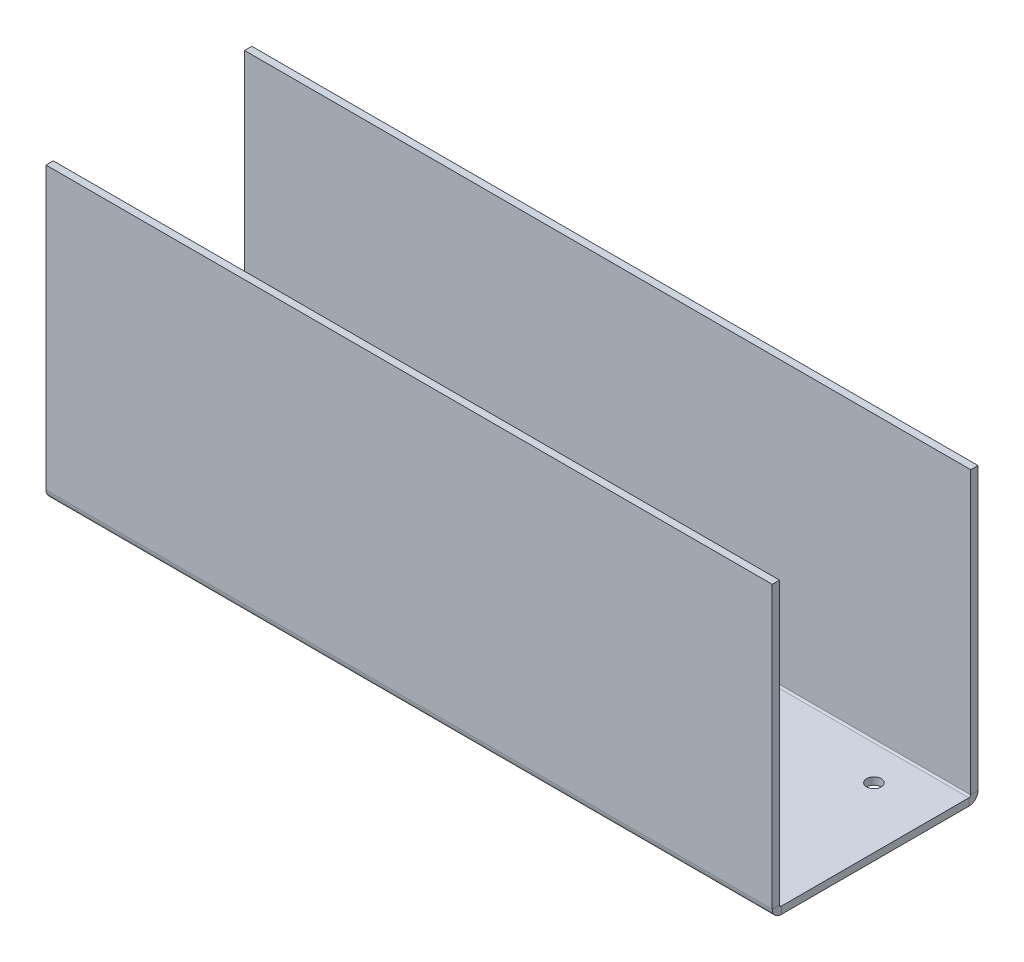
ISO-10303-21;
HEADER;
FILE_DESCRIPTION(('STEP AP214'),'2;1');
FILE_NAME('part.step','',(''),(''),'','','');
FILE_SCHEMA(('AUTOMOTIVE_DESIGN { 1 0 10303 214 1 1 1 1 }'));
ENDSEC;
DATA;
#1=APPLICATION_CONTEXT('core data for automotive mechanical design processes');
#2=APPLICATION_PROTOCOL_DEFINITION('international standard','automotive_design',2000,#1);
#3=PRODUCT_CONTEXT('',#1,'mechanical');
#4=PRODUCT('Part','Part','',(#3));
#5=PRODUCT_RELATED_PRODUCT_CATEGORY('part','',(#4));
#6=PRODUCT_DEFINITION_FORMATION('','',#4);
#7=PRODUCT_DEFINITION_CONTEXT('part definition',#1,'design');
#8=PRODUCT_DEFINITION('design','',#6,#7);
#9=PRODUCT_DEFINITION_SHAPE('','',#8);
#10=(LENGTH_UNIT() NAMED_UNIT(*) SI_UNIT(.MILLI.,.METRE.));
#11=(NAMED_UNIT(*) PLANE_ANGLE_UNIT() SI_UNIT($,.RADIAN.));
#12=(NAMED_UNIT(*) SI_UNIT($,.STERADIAN.) SOLID_ANGLE_UNIT());
#13=UNCERTAINTY_MEASURE_WITH_UNIT(LENGTH_MEASURE(1.E-05),#10,'distance_accuracy_value','');
#14=(GEOMETRIC_REPRESENTATION_CONTEXT(3) GLOBAL_UNCERTAINTY_ASSIGNED_CONTEXT((#13)) GLOBAL_UNIT_ASSIGNED_CONTEXT((#10,
#11,#12)) REPRESENTATION_CONTEXT('',''));
#15=CARTESIAN_POINT('',(0.,0.,0.));
#16=DIRECTION('',(0.,0.,1.));
#17=DIRECTION('',(1.,0.,0.));
#18=AXIS2_PLACEMENT_3D('',#15,#16,#17);
#19=CARTESIAN_POINT('',(0.,-3.,0.));
#20=DIRECTION('',(0.,1.,0.));
#21=DIRECTION('',(0.,0.,1.));
#22=AXIS2_PLACEMENT_3D('',#19,#20,#21);
#23=PLANE('',#22);
#24=CARTESIAN_POINT('',(-125.,-3.,20.4999999999996));
#25=DIRECTION('',(0.,1.,0.));
#26=DIRECTION('',(0.,0.,1.));
#27=AXIS2_PLACEMENT_3D('',#24,#25,#26);
#28=CIRCLE('',#27,2.99999999999999);
#29=CARTESIAN_POINT('',(-125.,-3.,23.4999999999996));
#30=VERTEX_POINT('',#29);
#31=EDGE_CURVE('E211',#30,#30,#28,.T.);
#32=ORIENTED_EDGE('',*,*,#31,.T.);
#33=EDGE_LOOP('',(#32));
#34=FACE_BOUND('',#33,.T.);
#35=CARTESIAN_POINT('',(125.,-3.,-24.5000000000004));
#36=DIRECTION('',(0.,1.,0.));
#37=DIRECTION('',(0.,0.,1.));
#38=AXIS2_PLACEMENT_3D('',#35,#36,#37);
#39=CIRCLE('',#38,2.99999999999999);
#40=CARTESIAN_POINT('',(125.,-3.,-21.5000000000004));
#41=VERTEX_POINT('',#40);
#42=EDGE_CURVE('E365',#41,#41,#39,.T.);
#43=ORIENTED_EDGE('',*,*,#42,.T.);
#44=EDGE_LOOP('',(#43));
#45=FACE_BOUND('',#44,.T.);
#46=CARTESIAN_POINT('',(125.,-3.,20.4999999999996));
#47=DIRECTION('',(0.,1.,0.));
#48=DIRECTION('',(0.,0.,1.));
#49=AXIS2_PLACEMENT_3D('',#46,#47,#48);
#50=CIRCLE('',#49,2.99999999999999);
#51=CARTESIAN_POINT('',(125.,-3.,23.4999999999996));
#52=VERTEX_POINT('',#51);
#53=EDGE_CURVE('E368',#52,#52,#50,.T.);
#54=ORIENTED_EDGE('',*,*,#53,.T.);
#55=EDGE_LOOP('',(#54));
#56=FACE_BOUND('',#55,.T.);
#57=CARTESIAN_POINT('',(-125.,-3.,-24.5000000000004));
#58=DIRECTION('',(0.,1.,0.));
#59=DIRECTION('',(0.,0.,1.));
#60=AXIS2_PLACEMENT_3D('',#57,#58,#59);
#61=CIRCLE('',#60,2.99999999999999);
#62=CARTESIAN_POINT('',(-125.,-3.,-21.5000000000004));
#63=VERTEX_POINT('',#62);
#64=EDGE_CURVE('E371',#63,#63,#61,.T.);
#65=ORIENTED_EDGE('',*,*,#64,.T.);
#66=EDGE_LOOP('',(#65));
#67=FACE_BOUND('',#66,.T.);
#68=DIRECTION('',(-1.,0.,0.));
#69=VECTOR('',#68,1.);
#70=CARTESIAN_POINT('',(-150.,-3.00000000000002,-38.7634));
#71=LINE('',#70,#69);
#72=CARTESIAN_POINT('',(-150.,-3.00000000000002,-38.7634));
#73=VERTEX_POINT('',#72);
#74=CARTESIAN_POINT('',(150.,-3.,-38.7634));
#75=VERTEX_POINT('',#74);
#76=EDGE_CURVE('E212',#73,#75,#71,.F.);
#77=ORIENTED_EDGE('',*,*,#76,.T.);
#78=DIRECTION('',(0.,0.,-1.));
#79=VECTOR('',#78,1.);
#80=CARTESIAN_POINT('',(150.,-3.,-42.5));
#81=LINE('',#80,#79);
#82=CARTESIAN_POINT('',(150.,-3.,38.7634));
#83=VERTEX_POINT('',#82);
#84=EDGE_CURVE('E88',#83,#75,#81,.T.);
#85=ORIENTED_EDGE('',*,*,#84,.F.);
#86=DIRECTION('',(1.,0.,0.));
#87=VECTOR('',#86,1.);
#88=CARTESIAN_POINT('',(150.,-3.,38.7634));
#89=LINE('',#88,#87);
#90=CARTESIAN_POINT('',(-150.,-3.,38.7634));
#91=VERTEX_POINT('',#90);
#92=EDGE_CURVE('E265',#83,#91,#89,.F.);
#93=ORIENTED_EDGE('',*,*,#92,.T.);
#94=DIRECTION('',(0.,0.,1.));
#95=VECTOR('',#94,1.);
#96=CARTESIAN_POINT('',(-150.,-3.,-42.5));
#97=LINE('',#96,#95);
#98=EDGE_CURVE('E13',#73,#91,#97,.T.);
#99=ORIENTED_EDGE('',*,*,#98,.F.);
#100=EDGE_LOOP('',(#77,#85,#93,#99));
#101=FACE_BOUND('',#100,.T.);
#102=ADVANCED_FACE('F79',(#34,#45,#56,#67,#101),#23,.F.);
#103=CARTESIAN_POINT('',(0.,0.,0.));
#104=DIRECTION('',(0.,1.,0.));
#105=DIRECTION('',(0.,0.,1.));
#106=AXIS2_PLACEMENT_3D('',#103,#104,#105);
#107=PLANE('',#106);
#108=CARTESIAN_POINT('',(-125.,0.,20.4999999999996));
#109=DIRECTION('',(0.,1.,0.));
#110=DIRECTION('',(0.,0.,1.));
#111=AXIS2_PLACEMENT_3D('',#108,#109,#110);
#112=CIRCLE('',#111,2.99999999999999);
#113=CARTESIAN_POINT('',(-125.,0.,23.4999999999996));
#114=VERTEX_POINT('',#113);
#115=EDGE_CURVE('E377',#114,#114,#112,.T.);
#116=ORIENTED_EDGE('',*,*,#115,.F.);
#117=EDGE_LOOP('',(#116));
#118=FACE_BOUND('',#117,.T.);
#119=CARTESIAN_POINT('',(125.,0.,-24.5000000000004));
#120=DIRECTION('',(0.,1.,0.));
#121=DIRECTION('',(0.,0.,1.));
#122=AXIS2_PLACEMENT_3D('',#119,#120,#121);
#123=CIRCLE('',#122,2.99999999999999);
#124=CARTESIAN_POINT('',(125.,0.,-21.5000000000004));
#125=VERTEX_POINT('',#124);
#126=EDGE_CURVE('E378',#125,#125,#123,.T.);
#127=ORIENTED_EDGE('',*,*,#126,.F.);
#128=EDGE_LOOP('',(#127));
#129=FACE_BOUND('',#128,.T.);
#130=CARTESIAN_POINT('',(125.,0.,20.4999999999996));
#131=DIRECTION('',(0.,1.,0.));
#132=DIRECTION('',(0.,0.,1.));
#133=AXIS2_PLACEMENT_3D('',#130,#131,#132);
#134=CIRCLE('',#133,2.99999999999999);
#135=CARTESIAN_POINT('',(125.,0.,23.4999999999996));
#136=VERTEX_POINT('',#135);
#137=EDGE_CURVE('E381',#136,#136,#134,.T.);
#138=ORIENTED_EDGE('',*,*,#137,.F.);
#139=EDGE_LOOP('',(#138));
#140=FACE_BOUND('',#139,.T.);
#141=CARTESIAN_POINT('',(-125.,0.,-24.5000000000004));
#142=DIRECTION('',(0.,1.,0.));
#143=DIRECTION('',(0.,0.,1.));
#144=AXIS2_PLACEMENT_3D('',#141,#142,#143);
#145=CIRCLE('',#144,2.99999999999999);
#146=CARTESIAN_POINT('',(-125.,0.,-21.5000000000004));
#147=VERTEX_POINT('',#146);
#148=EDGE_CURVE('E374',#147,#147,#145,.T.);
#149=ORIENTED_EDGE('',*,*,#148,.F.);
#150=EDGE_LOOP('',(#149));
#151=FACE_BOUND('',#150,.T.);
#152=DIRECTION('',(0.,0.,-1.));
#153=VECTOR('',#152,1.);
#154=CARTESIAN_POINT('',(150.,0.,-42.5));
#155=LINE('',#154,#153);
#156=CARTESIAN_POINT('',(150.,0.,38.7634));
#157=VERTEX_POINT('',#156);
#158=CARTESIAN_POINT('',(150.,0.,-38.7634));
#159=VERTEX_POINT('',#158);
#160=EDGE_CURVE('E283',#157,#159,#155,.T.);
#161=ORIENTED_EDGE('',*,*,#160,.T.);
#162=DIRECTION('',(-1.,0.,0.));
#163=VECTOR('',#162,1.);
#164=CARTESIAN_POINT('',(-150.,0.,-38.7634));
#165=LINE('',#164,#163);
#166=CARTESIAN_POINT('',(-150.,0.,-38.7634));
#167=VERTEX_POINT('',#166);
#168=EDGE_CURVE('E224',#167,#159,#165,.F.);
#169=ORIENTED_EDGE('',*,*,#168,.F.);
#170=DIRECTION('',(0.,0.,1.));
#171=VECTOR('',#170,1.);
#172=CARTESIAN_POINT('',(-150.,0.,-42.5));
#173=LINE('',#172,#171);
#174=CARTESIAN_POINT('',(-150.,0.,38.7634));
#175=VERTEX_POINT('',#174);
#176=EDGE_CURVE('E83',#167,#175,#173,.T.);
#177=ORIENTED_EDGE('',*,*,#176,.T.);
#178=DIRECTION('',(1.,0.,0.));
#179=VECTOR('',#178,1.);
#180=CARTESIAN_POINT('',(150.,0.,38.7634));
#181=LINE('',#180,#179);
#182=EDGE_CURVE('E96',#157,#175,#181,.F.);
#183=ORIENTED_EDGE('',*,*,#182,.F.);
#184=EDGE_LOOP('',(#161,#169,#177,#183));
#185=FACE_BOUND('',#184,.T.);
#186=ADVANCED_FACE('F288',(#118,#129,#140,#151,#185),#107,.T.);
#187=CARTESIAN_POINT('',(-150.,-3.,-42.5));
#188=DIRECTION('',(-1.,0.,0.));
#189=DIRECTION('',(0.,0.,1.));
#190=AXIS2_PLACEMENT_3D('',#187,#188,#189);
#191=PLANE('',#190);
#192=ORIENTED_EDGE('',*,*,#176,.F.);
#193=DIRECTION('',(0.,-1.,0.));
#194=VECTOR('',#193,1.);
#195=CARTESIAN_POINT('',(-150.,0.,-38.7634));
#196=LINE('',#195,#194);
#197=EDGE_CURVE('E218',#167,#73,#196,.T.);
#198=ORIENTED_EDGE('',*,*,#197,.T.);
#199=ORIENTED_EDGE('',*,*,#98,.T.);
#200=DIRECTION('',(-1.50722647926305E-13,-1.,0.));
#201=VECTOR('',#200,1.);
#202=CARTESIAN_POINT('',(-150.,0.,38.7634));
#203=LINE('',#202,#201);
#204=EDGE_CURVE('E280',#175,#91,#203,.T.);
#205=ORIENTED_EDGE('',*,*,#204,.F.);
#206=EDGE_LOOP('',(#192,#198,#199,#205));
#207=FACE_BOUND('',#206,.T.);
#208=ADVANCED_FACE('F290',(#207),#191,.T.);
#209=CARTESIAN_POINT('',(150.,-3.,-42.5));
#210=DIRECTION('',(1.,0.,0.));
#211=DIRECTION('',(0.,0.,-1.));
#212=AXIS2_PLACEMENT_3D('',#209,#210,#211);
#213=PLANE('',#212);
#214=DIRECTION('',(1.50722647926305E-13,-1.,0.));
#215=VECTOR('',#214,1.);
#216=CARTESIAN_POINT('',(150.,0.,-38.7634));
#217=LINE('',#216,#215);
#218=EDGE_CURVE('E230',#159,#75,#217,.T.);
#219=ORIENTED_EDGE('',*,*,#218,.F.);
#220=ORIENTED_EDGE('',*,*,#160,.F.);
#221=DIRECTION('',(0.,-1.,0.));
#222=VECTOR('',#221,1.);
#223=CARTESIAN_POINT('',(150.,0.,38.7634));
#224=LINE('',#223,#222);
#225=EDGE_CURVE('E271',#157,#83,#224,.T.);
#226=ORIENTED_EDGE('',*,*,#225,.T.);
#227=ORIENTED_EDGE('',*,*,#84,.T.);
#228=EDGE_LOOP('',(#219,#220,#226,#227));
#229=FACE_BOUND('',#228,.T.);
#230=ADVANCED_FACE('F81',(#229),#213,.T.);
#231=CARTESIAN_POINT('',(-150.,0.7366,38.7634));
#232=DIRECTION('',(-1.,0.,0.));
#233=DIRECTION('',(0.,0.,1.));
#234=AXIS2_PLACEMENT_3D('',#231,#232,#233);
#235=PLANE('',#234);
#236=DIRECTION('',(0.,0.,-1.));
#237=VECTOR('',#236,1.);
#238=CARTESIAN_POINT('',(-150.,0.736599999999997,42.5));
#239=LINE('',#238,#237);
#240=CARTESIAN_POINT('',(-150.,0.7366,39.5));
#241=VERTEX_POINT('',#240);
#242=CARTESIAN_POINT('',(-150.,0.7366,42.5));
#243=VERTEX_POINT('',#242);
#244=EDGE_CURVE('E233',#241,#243,#239,.F.);
#245=ORIENTED_EDGE('',*,*,#244,.F.);
#246=CARTESIAN_POINT('',(-150.,0.7366,38.7634));
#247=DIRECTION('',(1.,0.,0.));
#248=DIRECTION('',(0.,0.,-1.));
#249=AXIS2_PLACEMENT_3D('',#246,#247,#248);
#250=CIRCLE('',#249,0.736599999999997);
#251=EDGE_CURVE('E274',#175,#241,#250,.F.);
#252=ORIENTED_EDGE('',*,*,#251,.F.);
#253=ORIENTED_EDGE('',*,*,#204,.T.);
#254=CARTESIAN_POINT('',(-150.,0.7366,38.7634));
#255=DIRECTION('',(1.,0.,0.));
#256=DIRECTION('',(0.,0.,-1.));
#257=AXIS2_PLACEMENT_3D('',#254,#255,#256);
#258=CIRCLE('',#257,3.7366);
#259=EDGE_CURVE('E267',#91,#243,#258,.F.);
#260=ORIENTED_EDGE('',*,*,#259,.T.);
#261=EDGE_LOOP('',(#245,#252,#253,#260));
#262=FACE_BOUND('',#261,.T.);
#263=ADVANCED_FACE('F298',(#262),#235,.T.);
#264=CARTESIAN_POINT('',(150.,0.7366,38.7634));
#265=DIRECTION('',(-1.,0.,0.));
#266=DIRECTION('',(0.,0.,1.));
#267=AXIS2_PLACEMENT_3D('',#264,#265,#266);
#268=PLANE('',#267);
#269=CARTESIAN_POINT('',(150.,0.7366,38.7634));
#270=DIRECTION('',(1.,0.,0.));
#271=DIRECTION('',(0.,0.,-1.));
#272=AXIS2_PLACEMENT_3D('',#269,#270,#271);
#273=CIRCLE('',#272,0.736599999999997);
#274=CARTESIAN_POINT('',(150.,0.7366,39.5));
#275=VERTEX_POINT('',#274);
#276=EDGE_CURVE('E238',#275,#157,#273,.T.);
#277=ORIENTED_EDGE('',*,*,#276,.F.);
#278=DIRECTION('',(0.,0.,-1.));
#279=VECTOR('',#278,1.);
#280=CARTESIAN_POINT('',(150.,0.736600000000004,39.5));
#281=LINE('',#280,#279);
#282=CARTESIAN_POINT('',(150.,0.736600000000004,42.5));
#283=VERTEX_POINT('',#282);
#284=EDGE_CURVE('E258',#275,#283,#281,.F.);
#285=ORIENTED_EDGE('',*,*,#284,.T.);
#286=CARTESIAN_POINT('',(150.,0.7366,38.7634));
#287=DIRECTION('',(1.,0.,0.));
#288=DIRECTION('',(0.,0.,-1.));
#289=AXIS2_PLACEMENT_3D('',#286,#287,#288);
#290=CIRCLE('',#289,3.7366);
#291=EDGE_CURVE('E268',#283,#83,#290,.T.);
#292=ORIENTED_EDGE('',*,*,#291,.T.);
#293=ORIENTED_EDGE('',*,*,#225,.F.);
#294=EDGE_LOOP('',(#277,#285,#292,#293));
#295=FACE_BOUND('',#294,.T.);
#296=ADVANCED_FACE('F319',(#295),#268,.F.);
#297=CARTESIAN_POINT('',(150.,0.7366,38.7634));
#298=DIRECTION('',(1.,0.,0.));
#299=DIRECTION('',(0.,0.,1.));
#300=AXIS2_PLACEMENT_3D('',#297,#298,#299);
#301=CYLINDRICAL_SURFACE('',#300,3.7366);
#302=ORIENTED_EDGE('',*,*,#92,.F.);
#303=ORIENTED_EDGE('',*,*,#291,.F.);
#304=DIRECTION('',(1.,0.,0.));
#305=VECTOR('',#304,1.);
#306=CARTESIAN_POINT('',(-150.,0.736599999999997,42.5));
#307=LINE('',#306,#305);
#308=EDGE_CURVE('E256',#283,#243,#307,.F.);
#309=ORIENTED_EDGE('',*,*,#308,.T.);
#310=ORIENTED_EDGE('',*,*,#259,.F.);
#311=EDGE_LOOP('',(#302,#303,#309,#310));
#312=FACE_BOUND('',#311,.T.);
#313=ADVANCED_FACE('F595',(#312),#301,.T.);
#314=CARTESIAN_POINT('',(150.,0.7366,38.7634));
#315=DIRECTION('',(1.,0.,0.));
#316=DIRECTION('',(0.,0.,1.));
#317=AXIS2_PLACEMENT_3D('',#314,#315,#316);
#318=CYLINDRICAL_SURFACE('',#317,0.736599999999997);
#319=ORIENTED_EDGE('',*,*,#182,.T.);
#320=ORIENTED_EDGE('',*,*,#251,.T.);
#321=DIRECTION('',(1.,0.,0.));
#322=VECTOR('',#321,1.);
#323=CARTESIAN_POINT('',(-150.,0.736599999999997,39.5));
#324=LINE('',#323,#322);
#325=EDGE_CURVE('E261',#241,#275,#324,.T.);
#326=ORIENTED_EDGE('',*,*,#325,.T.);
#327=ORIENTED_EDGE('',*,*,#276,.T.);
#328=EDGE_LOOP('',(#319,#320,#326,#327));
#329=FACE_BOUND('',#328,.T.);
#330=ADVANCED_FACE('F295',(#329),#318,.F.);
#331=CARTESIAN_POINT('',(-150.,0.,42.5));
#332=DIRECTION('',(1.,0.,0.));
#333=DIRECTION('',(0.,0.,-1.));
#334=AXIS2_PLACEMENT_3D('',#331,#332,#333);
#335=PLANE('',#334);
#336=ORIENTED_EDGE('',*,*,#244,.T.);
#337=DIRECTION('',(0.,-1.,0.));
#338=VECTOR('',#337,1.);
#339=CARTESIAN_POINT('',(-150.,0.,42.5));
#340=LINE('',#339,#338);
#341=CARTESIAN_POINT('',(-150.,117.,42.5));
#342=VERTEX_POINT('',#341);
#343=EDGE_CURVE('E246',#342,#243,#340,.T.);
#344=ORIENTED_EDGE('',*,*,#343,.F.);
#345=DIRECTION('',(0.,0.,-1.));
#346=VECTOR('',#345,1.);
#347=CARTESIAN_POINT('',(-150.,117.,42.5));
#348=LINE('',#347,#346);
#349=CARTESIAN_POINT('',(-150.,117.,39.5));
#350=VERTEX_POINT('',#349);
#351=EDGE_CURVE('E239',#342,#350,#348,.T.);
#352=ORIENTED_EDGE('',*,*,#351,.T.);
#353=DIRECTION('',(0.,1.,0.));
#354=VECTOR('',#353,1.);
#355=CARTESIAN_POINT('',(-150.,0.,39.5));
#356=LINE('',#355,#354);
#357=EDGE_CURVE('E253',#350,#241,#356,.F.);
#358=ORIENTED_EDGE('',*,*,#357,.T.);
#359=EDGE_LOOP('',(#336,#344,#352,#358));
#360=FACE_BOUND('',#359,.T.);
#361=ADVANCED_FACE('F301',(#360),#335,.F.);
#362=CARTESIAN_POINT('',(150.,117.,42.5));
#363=DIRECTION('',(-1.,0.,0.));
#364=DIRECTION('',(0.,-1.,0.));
#365=AXIS2_PLACEMENT_3D('',#362,#363,#364);
#366=PLANE('',#365);
#367=ORIENTED_EDGE('',*,*,#284,.F.);
#368=DIRECTION('',(0.,-1.,0.));
#369=VECTOR('',#368,1.);
#370=CARTESIAN_POINT('',(150.,117.,39.5));
#371=LINE('',#370,#369);
#372=CARTESIAN_POINT('',(150.,117.,39.5));
#373=VERTEX_POINT('',#372);
#374=EDGE_CURVE('E251',#275,#373,#371,.F.);
#375=ORIENTED_EDGE('',*,*,#374,.T.);
#376=DIRECTION('',(0.,0.,-1.));
#377=VECTOR('',#376,1.);
#378=CARTESIAN_POINT('',(150.,117.,42.5));
#379=LINE('',#378,#377);
#380=CARTESIAN_POINT('',(150.,117.,42.5));
#381=VERTEX_POINT('',#380);
#382=EDGE_CURVE('E235',#381,#373,#379,.T.);
#383=ORIENTED_EDGE('',*,*,#382,.F.);
#384=DIRECTION('',(0.,1.,0.));
#385=VECTOR('',#384,1.);
#386=CARTESIAN_POINT('',(150.,0.,42.5));
#387=LINE('',#386,#385);
#388=EDGE_CURVE('E244',#283,#381,#387,.T.);
#389=ORIENTED_EDGE('',*,*,#388,.F.);
#390=EDGE_LOOP('',(#367,#375,#383,#389));
#391=FACE_BOUND('',#390,.T.);
#392=ADVANCED_FACE('F321',(#391),#366,.F.);
#393=CARTESIAN_POINT('',(0.,0.,42.5));
#394=DIRECTION('',(0.,0.,-1.));
#395=DIRECTION('',(-1.,0.,0.));
#396=AXIS2_PLACEMENT_3D('',#393,#394,#395);
#397=PLANE('',#396);
#398=ORIENTED_EDGE('',*,*,#308,.F.);
#399=ORIENTED_EDGE('',*,*,#388,.T.);
#400=DIRECTION('',(-1.,0.,0.));
#401=VECTOR('',#400,1.);
#402=CARTESIAN_POINT('',(0.,117.,42.5));
#403=LINE('',#402,#401);
#404=EDGE_CURVE('E242',#381,#342,#403,.T.);
#405=ORIENTED_EDGE('',*,*,#404,.T.);
#406=ORIENTED_EDGE('',*,*,#343,.T.);
#407=EDGE_LOOP('',(#398,#399,#405,#406));
#408=FACE_BOUND('',#407,.T.);
#409=ADVANCED_FACE('F305',(#408),#397,.F.);
#410=CARTESIAN_POINT('',(0.,0.,39.5));
#411=DIRECTION('',(0.,0.,-1.));
#412=DIRECTION('',(-1.,0.,0.));
#413=AXIS2_PLACEMENT_3D('',#410,#411,#412);
#414=PLANE('',#413);
#415=ORIENTED_EDGE('',*,*,#374,.F.);
#416=ORIENTED_EDGE('',*,*,#325,.F.);
#417=ORIENTED_EDGE('',*,*,#357,.F.);
#418=DIRECTION('',(1.,0.,0.));
#419=VECTOR('',#418,1.);
#420=CARTESIAN_POINT('',(-150.,117.,39.5));
#421=LINE('',#420,#419);
#422=EDGE_CURVE('E249',#373,#350,#421,.F.);
#423=ORIENTED_EDGE('',*,*,#422,.F.);
#424=EDGE_LOOP('',(#415,#416,#417,#423));
#425=FACE_BOUND('',#424,.T.);
#426=ADVANCED_FACE('F315',(#425),#414,.T.);
#427=CARTESIAN_POINT('',(-150.,117.,42.5));
#428=DIRECTION('',(0.,-1.,0.));
#429=DIRECTION('',(0.,0.,-1.));
#430=AXIS2_PLACEMENT_3D('',#427,#428,#429);
#431=PLANE('',#430);
#432=ORIENTED_EDGE('',*,*,#422,.T.);
#433=ORIENTED_EDGE('',*,*,#351,.F.);
#434=ORIENTED_EDGE('',*,*,#404,.F.);
#435=ORIENTED_EDGE('',*,*,#382,.T.);
#436=EDGE_LOOP('',(#432,#433,#434,#435));
#437=FACE_BOUND('',#436,.T.);
#438=ADVANCED_FACE('F311',(#437),#431,.F.);
#439=CARTESIAN_POINT('',(150.,0.736599999999999,-38.7634));
#440=DIRECTION('',(1.,0.,0.));
#441=DIRECTION('',(0.,1.,0.));
#442=AXIS2_PLACEMENT_3D('',#439,#440,#441);
#443=PLANE('',#442);
#444=DIRECTION('',(0.,0.,1.));
#445=VECTOR('',#444,1.);
#446=CARTESIAN_POINT('',(150.,0.736600000000018,-42.5));
#447=LINE('',#446,#445);
#448=CARTESIAN_POINT('',(150.,0.736599999999997,-39.5));
#449=VERTEX_POINT('',#448);
#450=CARTESIAN_POINT('',(150.,0.736599999999986,-42.5));
#451=VERTEX_POINT('',#450);
#452=EDGE_CURVE('E194',#449,#451,#447,.F.);
#453=ORIENTED_EDGE('',*,*,#452,.F.);
#454=CARTESIAN_POINT('',(150.,0.736599999999999,-38.7634));
#455=DIRECTION('',(-1.,0.,0.));
#456=DIRECTION('',(0.,-1.,0.));
#457=AXIS2_PLACEMENT_3D('',#454,#455,#456);
#458=CIRCLE('',#457,0.736599999999997);
#459=EDGE_CURVE('E221',#159,#449,#458,.F.);
#460=ORIENTED_EDGE('',*,*,#459,.F.);
#461=ORIENTED_EDGE('',*,*,#218,.T.);
#462=CARTESIAN_POINT('',(150.,0.736599999999999,-38.7634));
#463=DIRECTION('',(-1.,0.,0.));
#464=DIRECTION('',(0.,-1.,0.));
#465=AXIS2_PLACEMENT_3D('',#462,#463,#464);
#466=CIRCLE('',#465,3.7366);
#467=EDGE_CURVE('E214',#75,#451,#466,.F.);
#468=ORIENTED_EDGE('',*,*,#467,.T.);
#469=EDGE_LOOP('',(#453,#460,#461,#468));
#470=FACE_BOUND('',#469,.T.);
#471=ADVANCED_FACE('F354',(#470),#443,.T.);
#472=CARTESIAN_POINT('',(-150.,0.736599999999977,-38.7634));
#473=DIRECTION('',(1.,0.,0.));
#474=DIRECTION('',(0.,1.,0.));
#475=AXIS2_PLACEMENT_3D('',#472,#473,#474);
#476=PLANE('',#475);
#477=CARTESIAN_POINT('',(-150.,0.736599999999977,-38.7634));
#478=DIRECTION('',(-1.,0.,0.));
#479=DIRECTION('',(0.,-1.,0.));
#480=AXIS2_PLACEMENT_3D('',#477,#478,#479);
#481=CIRCLE('',#480,0.736599999999997);
#482=CARTESIAN_POINT('',(-150.,0.736599999999975,-39.5));
#483=VERTEX_POINT('',#482);
#484=EDGE_CURVE('E227',#483,#167,#481,.T.);
#485=ORIENTED_EDGE('',*,*,#484,.F.);
#486=DIRECTION('',(0.,0.,1.));
#487=VECTOR('',#486,1.);
#488=CARTESIAN_POINT('',(-150.,0.73659999999999,-39.5));
#489=LINE('',#488,#487);
#490=CARTESIAN_POINT('',(-150.,0.736600000000011,-42.5));
#491=VERTEX_POINT('',#490);
#492=EDGE_CURVE('E205',#483,#491,#489,.F.);
#493=ORIENTED_EDGE('',*,*,#492,.T.);
#494=CARTESIAN_POINT('',(-150.,0.736599999999977,-38.7634));
#495=DIRECTION('',(-1.,0.,0.));
#496=DIRECTION('',(0.,-1.,0.));
#497=AXIS2_PLACEMENT_3D('',#494,#495,#496);
#498=CIRCLE('',#497,3.7366);
#499=EDGE_CURVE('E215',#491,#73,#498,.T.);
#500=ORIENTED_EDGE('',*,*,#499,.T.);
#501=ORIENTED_EDGE('',*,*,#197,.F.);
#502=EDGE_LOOP('',(#485,#493,#500,#501));
#503=FACE_BOUND('',#502,.T.);
#504=ADVANCED_FACE('F403',(#503),#476,.F.);
#505=CARTESIAN_POINT('',(-150.,0.736599999999977,-38.7634));
#506=DIRECTION('',(-1.,0.,0.));
#507=DIRECTION('',(0.,0.,-1.));
#508=AXIS2_PLACEMENT_3D('',#505,#506,#507);
#509=CYLINDRICAL_SURFACE('',#508,3.7366);
#510=ORIENTED_EDGE('',*,*,#76,.F.);
#511=ORIENTED_EDGE('',*,*,#499,.F.);
#512=DIRECTION('',(-1.,0.,0.));
#513=VECTOR('',#512,1.);
#514=CARTESIAN_POINT('',(150.,0.736600000000018,-42.5));
#515=LINE('',#514,#513);
#516=EDGE_CURVE('E203',#491,#451,#515,.F.);
#517=ORIENTED_EDGE('',*,*,#516,.T.);
#518=ORIENTED_EDGE('',*,*,#467,.F.);
#519=EDGE_LOOP('',(#510,#511,#517,#518));
#520=FACE_BOUND('',#519,.T.);
#521=ADVANCED_FACE('F357',(#520),#509,.T.);
#522=CARTESIAN_POINT('',(-150.,0.736599999999977,-38.7634));
#523=DIRECTION('',(-1.,0.,0.));
#524=DIRECTION('',(0.,0.,-1.));
#525=AXIS2_PLACEMENT_3D('',#522,#523,#524);
#526=CYLINDRICAL_SURFACE('',#525,0.736599999999997);
#527=ORIENTED_EDGE('',*,*,#168,.T.);
#528=ORIENTED_EDGE('',*,*,#459,.T.);
#529=DIRECTION('',(-1.,0.,0.));
#530=VECTOR('',#529,1.);
#531=CARTESIAN_POINT('',(150.,0.736599999999997,-39.5));
#532=LINE('',#531,#530);
#533=EDGE_CURVE('E208',#449,#483,#532,.T.);
#534=ORIENTED_EDGE('',*,*,#533,.T.);
#535=ORIENTED_EDGE('',*,*,#484,.T.);
#536=EDGE_LOOP('',(#527,#528,#534,#535));
#537=FACE_BOUND('',#536,.T.);
#538=ADVANCED_FACE('F405',(#537),#526,.F.);
#539=CARTESIAN_POINT('',(150.,0.,-42.5));
#540=DIRECTION('',(-1.,0.,0.));
#541=DIRECTION('',(0.,0.,1.));
#542=AXIS2_PLACEMENT_3D('',#539,#540,#541);
#543=PLANE('',#542);
#544=ORIENTED_EDGE('',*,*,#452,.T.);
#545=DIRECTION('',(0.,-1.,0.));
#546=VECTOR('',#545,1.);
#547=CARTESIAN_POINT('',(150.,-1.59186208666507E-13,-42.5));
#548=LINE('',#547,#546);
#549=CARTESIAN_POINT('',(150.,117.,-42.5000000000004));
#550=VERTEX_POINT('',#549);
#551=EDGE_CURVE('E175',#550,#451,#548,.T.);
#552=ORIENTED_EDGE('',*,*,#551,.F.);
#553=DIRECTION('',(0.,0.,1.));
#554=VECTOR('',#553,1.);
#555=CARTESIAN_POINT('',(150.,117.,-42.5000000000004));
#556=LINE('',#555,#554);
#557=CARTESIAN_POINT('',(150.,117.,-39.5000000000004));
#558=VERTEX_POINT('',#557);
#559=EDGE_CURVE('E181',#550,#558,#556,.T.);
#560=ORIENTED_EDGE('',*,*,#559,.T.);
#561=DIRECTION('',(0.,1.,0.));
#562=VECTOR('',#561,1.);
#563=CARTESIAN_POINT('',(150.,0.,-39.5));
#564=LINE('',#563,#562);
#565=EDGE_CURVE('E201',#558,#449,#564,.F.);
#566=ORIENTED_EDGE('',*,*,#565,.T.);
#567=EDGE_LOOP('',(#544,#552,#560,#566));
#568=FACE_BOUND('',#567,.T.);
#569=ADVANCED_FACE('F193',(#568),#543,.F.);
#570=CARTESIAN_POINT('',(-150.,117.,-42.5000000000004));
#571=DIRECTION('',(1.,0.,0.));
#572=DIRECTION('',(0.,0.,-1.));
#573=AXIS2_PLACEMENT_3D('',#570,#571,#572);
#574=PLANE('',#573);
#575=ORIENTED_EDGE('',*,*,#492,.F.);
#576=DIRECTION('',(0.,-1.,0.));
#577=VECTOR('',#576,1.);
#578=CARTESIAN_POINT('',(-150.,117.,-39.5000000000004));
#579=LINE('',#578,#577);
#580=CARTESIAN_POINT('',(-150.,117.,-39.5000000000004));
#581=VERTEX_POINT('',#580);
#582=EDGE_CURVE('E197',#483,#581,#579,.F.);
#583=ORIENTED_EDGE('',*,*,#582,.T.);
#584=DIRECTION('',(0.,0.,1.));
#585=VECTOR('',#584,1.);
#586=CARTESIAN_POINT('',(-150.,117.,-42.5000000000004));
#587=LINE('',#586,#585);
#588=CARTESIAN_POINT('',(-150.,117.,-42.5000000000004));
#589=VERTEX_POINT('',#588);
#590=EDGE_CURVE('E190',#589,#581,#587,.T.);
#591=ORIENTED_EDGE('',*,*,#590,.F.);
#592=DIRECTION('',(0.,1.,0.));
#593=VECTOR('',#592,1.);
#594=CARTESIAN_POINT('',(-150.,-1.59186208666507E-13,-42.5));
#595=LINE('',#594,#593);
#596=EDGE_CURVE('E177',#491,#589,#595,.T.);
#597=ORIENTED_EDGE('',*,*,#596,.F.);
#598=EDGE_LOOP('',(#575,#583,#591,#597));
#599=FACE_BOUND('',#598,.T.);
#600=ADVANCED_FACE('F360',(#599),#574,.F.);
#601=CARTESIAN_POINT('',(0.,-1.59186208666507E-13,-42.5));
#602=DIRECTION('',(0.,0.,1.));
#603=DIRECTION('',(0.,-1.,0.));
#604=AXIS2_PLACEMENT_3D('',#601,#602,#603);
#605=PLANE('',#604);
#606=ORIENTED_EDGE('',*,*,#516,.F.);
#607=ORIENTED_EDGE('',*,*,#596,.T.);
#608=DIRECTION('',(1.,0.,0.));
#609=VECTOR('',#608,1.);
#610=CARTESIAN_POINT('',(0.,117.,-42.5000000000004));
#611=LINE('',#610,#609);
#612=EDGE_CURVE('E170',#589,#550,#611,.T.);
#613=ORIENTED_EDGE('',*,*,#612,.T.);
#614=ORIENTED_EDGE('',*,*,#551,.T.);
#615=EDGE_LOOP('',(#606,#607,#613,#614));
#616=FACE_BOUND('',#615,.T.);
#617=ADVANCED_FACE('F173',(#616),#605,.F.);
#618=CARTESIAN_POINT('',(0.,-1.48711764649978E-13,-39.5));
#619=DIRECTION('',(0.,0.,1.));
#620=DIRECTION('',(0.,-1.,0.));
#621=AXIS2_PLACEMENT_3D('',#618,#619,#620);
#622=PLANE('',#621);
#623=ORIENTED_EDGE('',*,*,#582,.F.);
#624=ORIENTED_EDGE('',*,*,#533,.F.);
#625=ORIENTED_EDGE('',*,*,#565,.F.);
#626=DIRECTION('',(-1.,0.,0.));
#627=VECTOR('',#626,1.);
#628=CARTESIAN_POINT('',(150.,117.,-39.5000000000004));
#629=LINE('',#628,#627);
#630=EDGE_CURVE('E186',#581,#558,#629,.F.);
#631=ORIENTED_EDGE('',*,*,#630,.F.);
#632=EDGE_LOOP('',(#623,#624,#625,#631));
#633=FACE_BOUND('',#632,.T.);
#634=ADVANCED_FACE('F408',(#633),#622,.T.);
#635=CARTESIAN_POINT('',(150.,117.,-42.5000000000004));
#636=DIRECTION('',(0.,-1.,0.));
#637=DIRECTION('',(0.,0.,-1.));
#638=AXIS2_PLACEMENT_3D('',#635,#636,#637);
#639=PLANE('',#638);
#640=ORIENTED_EDGE('',*,*,#630,.T.);
#641=ORIENTED_EDGE('',*,*,#559,.F.);
#642=ORIENTED_EDGE('',*,*,#612,.F.);
#643=ORIENTED_EDGE('',*,*,#590,.T.);
#644=EDGE_LOOP('',(#640,#641,#642,#643));
#645=FACE_BOUND('',#644,.T.);
#646=ADVANCED_FACE('F184',(#645),#639,.F.);
#647=CARTESIAN_POINT('',(-125.,-10.,-24.5000000000004));
#648=DIRECTION('',(0.,1.,0.));
#649=DIRECTION('',(0.,0.,1.));
#650=AXIS2_PLACEMENT_3D('',#647,#648,#649);
#651=CYLINDRICAL_SURFACE('',#650,2.99999999999999);
#652=ORIENTED_EDGE('',*,*,#148,.T.);
#653=EDGE_LOOP('',(#652));
#654=FACE_BOUND('',#653,.T.);
#655=ORIENTED_EDGE('',*,*,#64,.F.);
#656=EDGE_LOOP('',(#655));
#657=FACE_BOUND('',#656,.T.);
#658=ADVANCED_FACE('F393',(#654,#657),#651,.F.);
#659=CARTESIAN_POINT('',(125.,-10.,20.4999999999996));
#660=DIRECTION('',(0.,1.,0.));
#661=DIRECTION('',(0.,0.,1.));
#662=AXIS2_PLACEMENT_3D('',#659,#660,#661);
#663=CYLINDRICAL_SURFACE('',#662,2.99999999999999);
#664=ORIENTED_EDGE('',*,*,#137,.T.);
#665=EDGE_LOOP('',(#664));
#666=FACE_BOUND('',#665,.T.);
#667=ORIENTED_EDGE('',*,*,#53,.F.);
#668=EDGE_LOOP('',(#667));
#669=FACE_BOUND('',#668,.T.);
#670=ADVANCED_FACE('F387',(#666,#669),#663,.F.);
#671=CARTESIAN_POINT('',(125.,-10.,-24.5000000000004));
#672=DIRECTION('',(0.,1.,0.));
#673=DIRECTION('',(0.,0.,1.));
#674=AXIS2_PLACEMENT_3D('',#671,#672,#673);
#675=CYLINDRICAL_SURFACE('',#674,2.99999999999999);
#676=ORIENTED_EDGE('',*,*,#126,.T.);
#677=EDGE_LOOP('',(#676));
#678=FACE_BOUND('',#677,.T.);
#679=ORIENTED_EDGE('',*,*,#42,.F.);
#680=EDGE_LOOP('',(#679));
#681=FACE_BOUND('',#680,.T.);
#682=ADVANCED_FACE('F507',(#678,#681),#675,.F.);
#683=CARTESIAN_POINT('',(-125.,-10.,20.4999999999996));
#684=DIRECTION('',(0.,1.,0.));
#685=DIRECTION('',(0.,0.,1.));
#686=AXIS2_PLACEMENT_3D('',#683,#684,#685);
#687=CYLINDRICAL_SURFACE('',#686,2.99999999999999);
#688=ORIENTED_EDGE('',*,*,#115,.T.);
#689=EDGE_LOOP('',(#688));
#690=FACE_BOUND('',#689,.T.);
#691=ORIENTED_EDGE('',*,*,#31,.F.);
#692=EDGE_LOOP('',(#691));
#693=FACE_BOUND('',#692,.T.);
#694=ADVANCED_FACE('F517',(#690,#693),#687,.F.);
#695=CLOSED_SHELL('',(#102,#186,#208,#230,#263,#296,#313,#330,#361,#392,#409,#426,#438,#471,
#504,#521,#538,#569,#600,#617,#634,#646,#658,#670,#682,#694));
#696=MANIFOLD_SOLID_BREP('B2',#695);
#697=ADVANCED_BREP_SHAPE_REPRESENTATION('',(#18,#696),#14);
#698=SHAPE_DEFINITION_REPRESENTATION(#9,#697);
ENDSEC;
END-ISO-10303-21;
